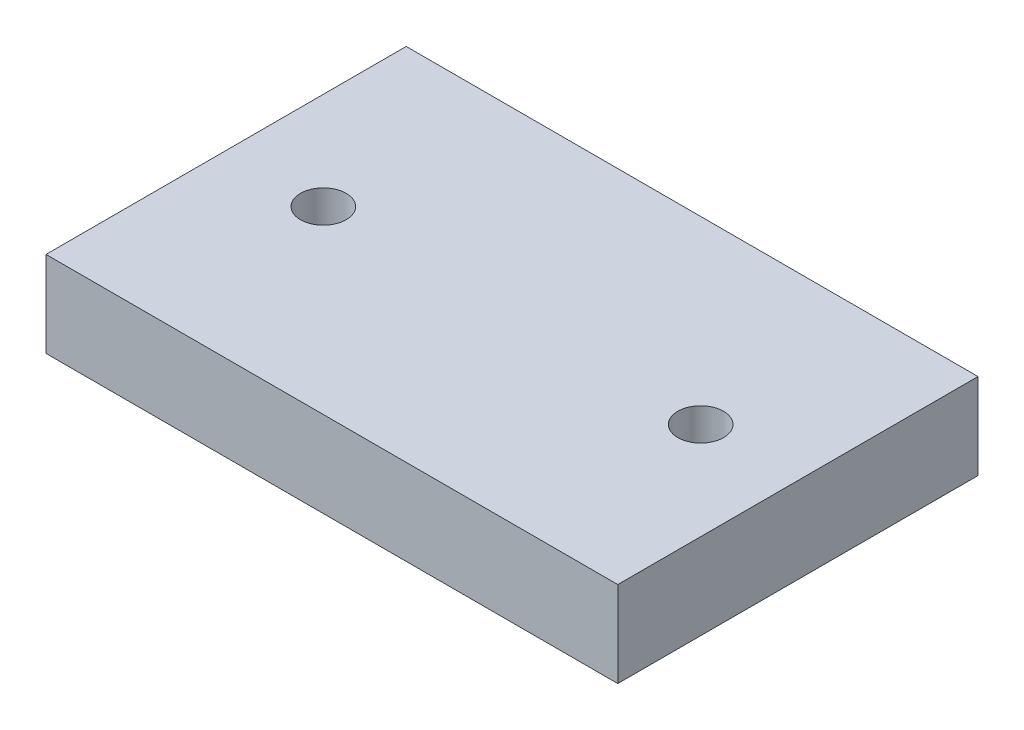
ISO-10303-21;
HEADER;
FILE_DESCRIPTION(('STEP AP214'),'2;1');
FILE_NAME('part.step','',(''),(''),'','','');
FILE_SCHEMA(('AUTOMOTIVE_DESIGN { 1 0 10303 214 1 1 1 1 }'));
ENDSEC;
DATA;
#1=APPLICATION_CONTEXT('core data for automotive mechanical design processes');
#2=APPLICATION_PROTOCOL_DEFINITION('international standard','automotive_design',2000,#1);
#3=PRODUCT_CONTEXT('',#1,'mechanical');
#4=PRODUCT('Part','Part','',(#3));
#5=PRODUCT_RELATED_PRODUCT_CATEGORY('part','',(#4));
#6=PRODUCT_DEFINITION_FORMATION('','',#4);
#7=PRODUCT_DEFINITION_CONTEXT('part definition',#1,'design');
#8=PRODUCT_DEFINITION('design','',#6,#7);
#9=PRODUCT_DEFINITION_SHAPE('','',#8);
#10=(LENGTH_UNIT() NAMED_UNIT(*) SI_UNIT(.MILLI.,.METRE.));
#11=(NAMED_UNIT(*) PLANE_ANGLE_UNIT() SI_UNIT($,.RADIAN.));
#12=(NAMED_UNIT(*) SI_UNIT($,.STERADIAN.) SOLID_ANGLE_UNIT());
#13=UNCERTAINTY_MEASURE_WITH_UNIT(LENGTH_MEASURE(1.E-05),#10,'distance_accuracy_value','');
#14=(GEOMETRIC_REPRESENTATION_CONTEXT(3) GLOBAL_UNCERTAINTY_ASSIGNED_CONTEXT((#13)) GLOBAL_UNIT_ASSIGNED_CONTEXT((#10,
#11,#12)) REPRESENTATION_CONTEXT('',''));
#15=CARTESIAN_POINT('',(0.,0.,0.));
#16=DIRECTION('',(0.,0.,1.));
#17=DIRECTION('',(1.,0.,0.));
#18=AXIS2_PLACEMENT_3D('',#15,#16,#17);
#19=CARTESIAN_POINT('',(0.,15.,0.));
#20=DIRECTION('',(0.,-1.,0.));
#21=DIRECTION('',(0.,0.,-1.));
#22=AXIS2_PLACEMENT_3D('',#19,#20,#21);
#23=PLANE('',#22);
#24=CARTESIAN_POINT('',(17.,15.,-31.5));
#25=DIRECTION('',(0.,1.,0.));
#26=DIRECTION('',(0.,0.,1.));
#27=AXIS2_PLACEMENT_3D('',#24,#25,#26);
#28=CIRCLE('',#27,3.99999999999999);
#29=CARTESIAN_POINT('',(17.,15.,-27.5));
#30=VERTEX_POINT('',#29);
#31=EDGE_CURVE('E100',#30,#30,#28,.T.);
#32=ORIENTED_EDGE('',*,*,#31,.F.);
#33=EDGE_LOOP('',(#32));
#34=FACE_BOUND('',#33,.T.);
#35=DIRECTION('',(0.,0.,1.));
#36=VECTOR('',#35,1.);
#37=CARTESIAN_POINT('',(0.,15.,0.));
#38=LINE('',#37,#36);
#39=CARTESIAN_POINT('',(0.,15.,-63.));
#40=VERTEX_POINT('',#39);
#41=CARTESIAN_POINT('',(0.,15.,0.));
#42=VERTEX_POINT('',#41);
#43=EDGE_CURVE('E85',#40,#42,#38,.T.);
#44=ORIENTED_EDGE('',*,*,#43,.T.);
#45=DIRECTION('',(1.,0.,0.));
#46=VECTOR('',#45,1.);
#47=CARTESIAN_POINT('',(0.,15.,0.));
#48=LINE('',#47,#46);
#49=CARTESIAN_POINT('',(100.,15.,0.));
#50=VERTEX_POINT('',#49);
#51=EDGE_CURVE('E80',#42,#50,#48,.T.);
#52=ORIENTED_EDGE('',*,*,#51,.T.);
#53=DIRECTION('',(0.,0.,-1.));
#54=VECTOR('',#53,1.);
#55=CARTESIAN_POINT('',(100.,15.,0.));
#56=LINE('',#55,#54);
#57=CARTESIAN_POINT('',(100.,15.,-63.));
#58=VERTEX_POINT('',#57);
#59=EDGE_CURVE('E83',#50,#58,#56,.T.);
#60=ORIENTED_EDGE('',*,*,#59,.T.);
#61=DIRECTION('',(-1.,0.,0.));
#62=VECTOR('',#61,1.);
#63=CARTESIAN_POINT('',(0.,15.,-63.));
#64=LINE('',#63,#62);
#65=EDGE_CURVE('E50',#58,#40,#64,.T.);
#66=ORIENTED_EDGE('',*,*,#65,.T.);
#67=EDGE_LOOP('',(#44,#52,#60,#66));
#68=FACE_BOUND('',#67,.T.);
#69=CARTESIAN_POINT('',(83.,15.,-31.5));
#70=DIRECTION('',(0.,1.,0.));
#71=DIRECTION('',(0.,0.,1.));
#72=AXIS2_PLACEMENT_3D('',#69,#70,#71);
#73=CIRCLE('',#72,4.00000000000001);
#74=CARTESIAN_POINT('',(83.,15.,-27.5));
#75=VERTEX_POINT('',#74);
#76=EDGE_CURVE('E115',#75,#75,#73,.T.);
#77=ORIENTED_EDGE('',*,*,#76,.F.);
#78=EDGE_LOOP('',(#77));
#79=FACE_BOUND('',#78,.T.);
#80=ADVANCED_FACE('F33',(#34,#68,#79),#23,.F.);
#81=CARTESIAN_POINT('',(0.,0.,0.));
#82=DIRECTION('',(0.,-1.,0.));
#83=DIRECTION('',(0.,0.,-1.));
#84=AXIS2_PLACEMENT_3D('',#81,#82,#83);
#85=PLANE('',#84);
#86=CARTESIAN_POINT('',(17.,0.,-31.5));
#87=DIRECTION('',(0.,1.,0.));
#88=DIRECTION('',(0.,0.,1.));
#89=AXIS2_PLACEMENT_3D('',#86,#87,#88);
#90=CIRCLE('',#89,3.99999999999999);
#91=CARTESIAN_POINT('',(17.,0.,-27.5));
#92=VERTEX_POINT('',#91);
#93=EDGE_CURVE('E112',#92,#92,#90,.T.);
#94=ORIENTED_EDGE('',*,*,#93,.T.);
#95=EDGE_LOOP('',(#94));
#96=FACE_BOUND('',#95,.T.);
#97=DIRECTION('',(0.,0.,1.));
#98=VECTOR('',#97,1.);
#99=CARTESIAN_POINT('',(0.,0.,0.));
#100=LINE('',#99,#98);
#101=CARTESIAN_POINT('',(0.,0.,-63.));
#102=VERTEX_POINT('',#101);
#103=CARTESIAN_POINT('',(0.,0.,0.));
#104=VERTEX_POINT('',#103);
#105=EDGE_CURVE('E97',#102,#104,#100,.T.);
#106=ORIENTED_EDGE('',*,*,#105,.F.);
#107=DIRECTION('',(-1.,0.,0.));
#108=VECTOR('',#107,1.);
#109=CARTESIAN_POINT('',(0.,0.,-63.));
#110=LINE('',#109,#108);
#111=CARTESIAN_POINT('',(100.,0.,-63.));
#112=VERTEX_POINT('',#111);
#113=EDGE_CURVE('E73',#112,#102,#110,.T.);
#114=ORIENTED_EDGE('',*,*,#113,.F.);
#115=DIRECTION('',(0.,0.,-1.));
#116=VECTOR('',#115,1.);
#117=CARTESIAN_POINT('',(100.,0.,0.));
#118=LINE('',#117,#116);
#119=CARTESIAN_POINT('',(100.,0.,0.));
#120=VERTEX_POINT('',#119);
#121=EDGE_CURVE('E67',#120,#112,#118,.T.);
#122=ORIENTED_EDGE('',*,*,#121,.F.);
#123=DIRECTION('',(1.,0.,0.));
#124=VECTOR('',#123,1.);
#125=CARTESIAN_POINT('',(0.,0.,0.));
#126=LINE('',#125,#124);
#127=EDGE_CURVE('E89',#104,#120,#126,.T.);
#128=ORIENTED_EDGE('',*,*,#127,.F.);
#129=EDGE_LOOP('',(#106,#114,#122,#128));
#130=FACE_BOUND('',#129,.T.);
#131=CARTESIAN_POINT('',(83.,0.,-31.5));
#132=DIRECTION('',(0.,1.,0.));
#133=DIRECTION('',(0.,0.,1.));
#134=AXIS2_PLACEMENT_3D('',#131,#132,#133);
#135=CIRCLE('',#134,4.00000000000001);
#136=CARTESIAN_POINT('',(83.,0.,-27.5));
#137=VERTEX_POINT('',#136);
#138=EDGE_CURVE('E118',#137,#137,#135,.T.);
#139=ORIENTED_EDGE('',*,*,#138,.T.);
#140=EDGE_LOOP('',(#139));
#141=FACE_BOUND('',#140,.T.);
#142=ADVANCED_FACE('F108',(#96,#130,#141),#85,.T.);
#143=CARTESIAN_POINT('',(0.,15.,0.));
#144=DIRECTION('',(1.,0.,0.));
#145=DIRECTION('',(0.,0.,-1.));
#146=AXIS2_PLACEMENT_3D('',#143,#144,#145);
#147=PLANE('',#146);
#148=ORIENTED_EDGE('',*,*,#105,.T.);
#149=DIRECTION('',(0.,-1.,0.));
#150=VECTOR('',#149,1.);
#151=CARTESIAN_POINT('',(0.,15.,0.));
#152=LINE('',#151,#150);
#153=EDGE_CURVE('E11',#42,#104,#152,.T.);
#154=ORIENTED_EDGE('',*,*,#153,.F.);
#155=ORIENTED_EDGE('',*,*,#43,.F.);
#156=DIRECTION('',(0.,-1.,0.));
#157=VECTOR('',#156,1.);
#158=CARTESIAN_POINT('',(0.,15.,-63.));
#159=LINE('',#158,#157);
#160=EDGE_CURVE('E93',#40,#102,#159,.T.);
#161=ORIENTED_EDGE('',*,*,#160,.T.);
#162=EDGE_LOOP('',(#148,#154,#155,#161));
#163=FACE_BOUND('',#162,.T.);
#164=ADVANCED_FACE('F35',(#163),#147,.F.);
#165=CARTESIAN_POINT('',(0.,15.,0.));
#166=DIRECTION('',(0.,0.,-1.));
#167=DIRECTION('',(-1.,0.,0.));
#168=AXIS2_PLACEMENT_3D('',#165,#166,#167);
#169=PLANE('',#168);
#170=ORIENTED_EDGE('',*,*,#127,.T.);
#171=DIRECTION('',(0.,-1.,0.));
#172=VECTOR('',#171,1.);
#173=CARTESIAN_POINT('',(100.,15.,0.));
#174=LINE('',#173,#172);
#175=EDGE_CURVE('E42',#50,#120,#174,.T.);
#176=ORIENTED_EDGE('',*,*,#175,.F.);
#177=ORIENTED_EDGE('',*,*,#51,.F.);
#178=ORIENTED_EDGE('',*,*,#153,.T.);
#179=EDGE_LOOP('',(#170,#176,#177,#178));
#180=FACE_BOUND('',#179,.T.);
#181=ADVANCED_FACE('F88',(#180),#169,.F.);
#182=CARTESIAN_POINT('',(100.,15.,0.));
#183=DIRECTION('',(-1.,0.,0.));
#184=DIRECTION('',(0.,0.,1.));
#185=AXIS2_PLACEMENT_3D('',#182,#183,#184);
#186=PLANE('',#185);
#187=ORIENTED_EDGE('',*,*,#121,.T.);
#188=DIRECTION('',(0.,-1.,0.));
#189=VECTOR('',#188,1.);
#190=CARTESIAN_POINT('',(100.,15.,-63.));
#191=LINE('',#190,#189);
#192=EDGE_CURVE('E90',#58,#112,#191,.T.);
#193=ORIENTED_EDGE('',*,*,#192,.F.);
#194=ORIENTED_EDGE('',*,*,#59,.F.);
#195=ORIENTED_EDGE('',*,*,#175,.T.);
#196=EDGE_LOOP('',(#187,#193,#194,#195));
#197=FACE_BOUND('',#196,.T.);
#198=ADVANCED_FACE('F91',(#197),#186,.F.);
#199=CARTESIAN_POINT('',(0.,15.,-63.));
#200=DIRECTION('',(0.,0.,1.));
#201=DIRECTION('',(1.,0.,0.));
#202=AXIS2_PLACEMENT_3D('',#199,#200,#201);
#203=PLANE('',#202);
#204=ORIENTED_EDGE('',*,*,#113,.T.);
#205=ORIENTED_EDGE('',*,*,#160,.F.);
#206=ORIENTED_EDGE('',*,*,#65,.F.);
#207=ORIENTED_EDGE('',*,*,#192,.T.);
#208=EDGE_LOOP('',(#204,#205,#206,#207));
#209=FACE_BOUND('',#208,.T.);
#210=ADVANCED_FACE('F105',(#209),#203,.F.);
#211=CARTESIAN_POINT('',(17.,15.,-31.5));
#212=DIRECTION('',(0.,-1.,0.));
#213=DIRECTION('',(0.,0.,-1.));
#214=AXIS2_PLACEMENT_3D('',#211,#212,#213);
#215=CYLINDRICAL_SURFACE('',#214,3.99999999999999);
#216=ORIENTED_EDGE('',*,*,#31,.T.);
#217=EDGE_LOOP('',(#216));
#218=FACE_BOUND('',#217,.T.);
#219=ORIENTED_EDGE('',*,*,#93,.F.);
#220=EDGE_LOOP('',(#219));
#221=FACE_BOUND('',#220,.T.);
#222=ADVANCED_FACE('F136',(#218,#221),#215,.F.);
#223=CARTESIAN_POINT('',(83.,15.,-31.5));
#224=DIRECTION('',(0.,-1.,0.));
#225=DIRECTION('',(0.,0.,-1.));
#226=AXIS2_PLACEMENT_3D('',#223,#224,#225);
#227=CYLINDRICAL_SURFACE('',#226,4.00000000000001);
#228=ORIENTED_EDGE('',*,*,#76,.T.);
#229=EDGE_LOOP('',(#228));
#230=FACE_BOUND('',#229,.T.);
#231=ORIENTED_EDGE('',*,*,#138,.F.);
#232=EDGE_LOOP('',(#231));
#233=FACE_BOUND('',#232,.T.);
#234=ADVANCED_FACE('F124',(#230,#233),#227,.F.);
#235=CLOSED_SHELL('',(#80,#142,#164,#181,#198,#210,#222,#234));
#236=MANIFOLD_SOLID_BREP('B2',#235);
#237=ADVANCED_BREP_SHAPE_REPRESENTATION('',(#18,#236),#14);
#238=SHAPE_DEFINITION_REPRESENTATION(#9,#237);
ENDSEC;
END-ISO-10303-21;
